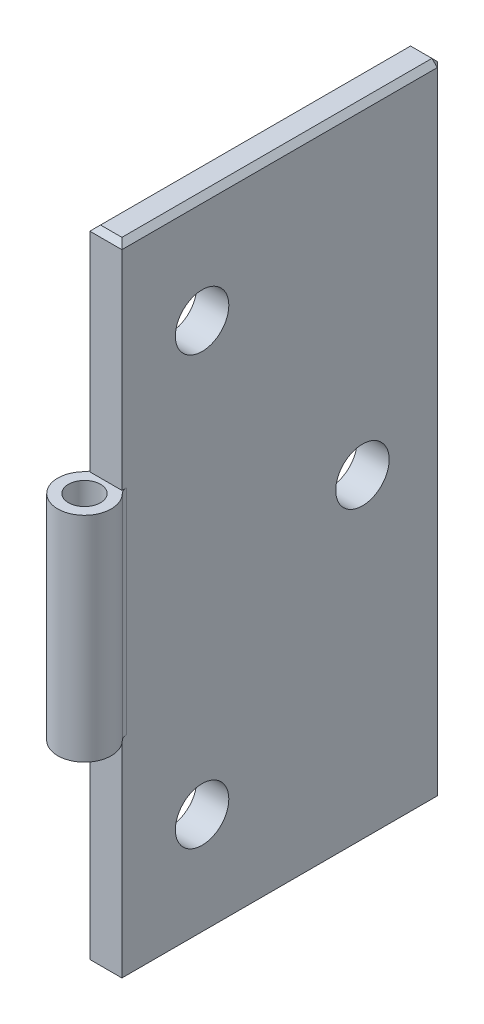
ISO-10303-21;
HEADER;
FILE_DESCRIPTION(('STEP AP214'),'2;1');
FILE_NAME('part.step','',(''),(''),'','','');
FILE_SCHEMA(('AUTOMOTIVE_DESIGN { 1 0 10303 214 1 1 1 1 }'));
ENDSEC;
DATA;
#1=APPLICATION_CONTEXT('core data for automotive mechanical design processes');
#2=APPLICATION_PROTOCOL_DEFINITION('international standard','automotive_design',2000,#1);
#3=PRODUCT_CONTEXT('',#1,'mechanical');
#4=PRODUCT('Part','Part','',(#3));
#5=PRODUCT_RELATED_PRODUCT_CATEGORY('part','',(#4));
#6=PRODUCT_DEFINITION_FORMATION('','',#4);
#7=PRODUCT_DEFINITION_CONTEXT('part definition',#1,'design');
#8=PRODUCT_DEFINITION('design','',#6,#7);
#9=PRODUCT_DEFINITION_SHAPE('','',#8);
#10=(LENGTH_UNIT() NAMED_UNIT(*) SI_UNIT(.MILLI.,.METRE.));
#11=(NAMED_UNIT(*) PLANE_ANGLE_UNIT() SI_UNIT($,.RADIAN.));
#12=(NAMED_UNIT(*) SI_UNIT($,.STERADIAN.) SOLID_ANGLE_UNIT());
#13=UNCERTAINTY_MEASURE_WITH_UNIT(LENGTH_MEASURE(1.E-05),#10,'distance_accuracy_value','');
#14=(GEOMETRIC_REPRESENTATION_CONTEXT(3) GLOBAL_UNCERTAINTY_ASSIGNED_CONTEXT((#13)) GLOBAL_UNIT_ASSIGNED_CONTEXT((#10,
#11,#12)) REPRESENTATION_CONTEXT('',''));
#15=CARTESIAN_POINT('',(0.,0.,0.));
#16=DIRECTION('',(0.,0.,1.));
#17=DIRECTION('',(1.,0.,0.));
#18=AXIS2_PLACEMENT_3D('',#15,#16,#17);
#19=CARTESIAN_POINT('',(1.5,-30.,15.));
#20=DIRECTION('',(0.,0.,-1.));
#21=DIRECTION('',(-1.,0.,0.));
#22=AXIS2_PLACEMENT_3D('',#19,#20,#21);
#23=PLANE('',#22);
#24=DIRECTION('',(0.,-1.,0.));
#25=VECTOR('',#24,1.);
#26=CARTESIAN_POINT('',(-1.5,-30.,15.));
#27=LINE('',#26,#25);
#28=CARTESIAN_POINT('',(-1.5,-10.,15.));
#29=VERTEX_POINT('',#28);
#30=CARTESIAN_POINT('',(-1.5,-29.5,15.));
#31=VERTEX_POINT('',#30);
#32=EDGE_CURVE('E181',#29,#31,#27,.T.);
#33=ORIENTED_EDGE('',*,*,#32,.T.);
#34=DIRECTION('',(1.,0.,0.));
#35=VECTOR('',#34,1.);
#36=CARTESIAN_POINT('',(1.5,-29.5,15.));
#37=LINE('',#36,#35);
#38=CARTESIAN_POINT('',(1.5,-29.5,15.));
#39=VERTEX_POINT('',#38);
#40=EDGE_CURVE('E177',#31,#39,#37,.T.);
#41=ORIENTED_EDGE('',*,*,#40,.T.);
#42=DIRECTION('',(0.,-1.,0.));
#43=VECTOR('',#42,1.);
#44=CARTESIAN_POINT('',(1.5,-30.,15.));
#45=LINE('',#44,#43);
#46=CARTESIAN_POINT('',(1.5,-10.,15.));
#47=VERTEX_POINT('',#46);
#48=EDGE_CURVE('E155',#47,#39,#45,.T.);
#49=ORIENTED_EDGE('',*,*,#48,.F.);
#50=DIRECTION('',(-1.,0.,0.));
#51=VECTOR('',#50,1.);
#52=CARTESIAN_POINT('',(-1.5,-10.,15.));
#53=LINE('',#52,#51);
#54=EDGE_CURVE('E164',#47,#29,#53,.T.);
#55=ORIENTED_EDGE('',*,*,#54,.T.);
#56=EDGE_LOOP('',(#33,#41,#49,#55));
#57=FACE_BOUND('',#56,.T.);
#58=ADVANCED_FACE('F36',(#57),#23,.F.);
#59=CARTESIAN_POINT('',(1.5,0.,0.));
#60=DIRECTION('',(1.,0.,0.));
#61=DIRECTION('',(0.,0.,-1.));
#62=AXIS2_PLACEMENT_3D('',#59,#60,#61);
#63=PLANE('',#62);
#64=CARTESIAN_POINT('',(1.5,0.,-7.5));
#65=DIRECTION('',(1.,0.,0.));
#66=DIRECTION('',(0.,0.,-1.));
#67=AXIS2_PLACEMENT_3D('',#64,#65,#66);
#68=CIRCLE('',#67,2.5);
#69=CARTESIAN_POINT('',(1.5,0.,-10.));
#70=VERTEX_POINT('',#69);
#71=EDGE_CURVE('E314',#70,#70,#68,.T.);
#72=ORIENTED_EDGE('',*,*,#71,.F.);
#73=EDGE_LOOP('',(#72));
#74=FACE_BOUND('',#73,.T.);
#75=ORIENTED_EDGE('',*,*,#48,.T.);
#76=DIRECTION('',(0.,0.,-1.));
#77=VECTOR('',#76,1.);
#78=CARTESIAN_POINT('',(1.5,-29.5,-15.));
#79=LINE('',#78,#77);
#80=CARTESIAN_POINT('',(1.5,-29.5,-14.5));
#81=VERTEX_POINT('',#80);
#82=EDGE_CURVE('E223',#39,#81,#79,.T.);
#83=ORIENTED_EDGE('',*,*,#82,.T.);
#84=DIRECTION('',(0.,1.,0.));
#85=VECTOR('',#84,1.);
#86=CARTESIAN_POINT('',(1.5,30.,-14.5));
#87=LINE('',#86,#85);
#88=CARTESIAN_POINT('',(1.5,29.5,-14.5));
#89=VERTEX_POINT('',#88);
#90=EDGE_CURVE('E221',#81,#89,#87,.T.);
#91=ORIENTED_EDGE('',*,*,#90,.T.);
#92=DIRECTION('',(0.,0.,1.));
#93=VECTOR('',#92,1.);
#94=CARTESIAN_POINT('',(1.5,29.5,15.));
#95=LINE('',#94,#93);
#96=CARTESIAN_POINT('',(1.5,29.5,15.));
#97=VERTEX_POINT('',#96);
#98=EDGE_CURVE('E219',#89,#97,#95,.T.);
#99=ORIENTED_EDGE('',*,*,#98,.T.);
#100=CARTESIAN_POINT('',(1.5,9.99999999999999,15.));
#101=VERTEX_POINT('',#100);
#102=EDGE_CURVE('E178',#97,#101,#45,.T.);
#103=ORIENTED_EDGE('',*,*,#102,.T.);
#104=DIRECTION('',(0.,0.,-1.));
#105=VECTOR('',#104,1.);
#106=CARTESIAN_POINT('',(1.5,9.99999999999999,17.));
#107=LINE('',#106,#105);
#108=CARTESIAN_POINT('',(1.5,9.99999999999999,14.5505102572168));
#109=VERTEX_POINT('',#108);
#110=EDGE_CURVE('E199',#101,#109,#107,.T.);
#111=ORIENTED_EDGE('',*,*,#110,.T.);
#112=DIRECTION('',(0.,-1.,0.));
#113=VECTOR('',#112,1.);
#114=CARTESIAN_POINT('',(1.5,-10.,14.5505102572168));
#115=LINE('',#114,#113);
#116=CARTESIAN_POINT('',(1.5,-10.,14.5505102572168));
#117=VERTEX_POINT('',#116);
#118=EDGE_CURVE('E158',#109,#117,#115,.T.);
#119=ORIENTED_EDGE('',*,*,#118,.T.);
#120=DIRECTION('',(0.,0.,1.));
#121=VECTOR('',#120,1.);
#122=CARTESIAN_POINT('',(1.5,-10.,0.));
#123=LINE('',#122,#121);
#124=EDGE_CURVE('E150',#117,#47,#123,.T.);
#125=ORIENTED_EDGE('',*,*,#124,.T.);
#126=EDGE_LOOP('',(#75,#83,#91,#99,#103,#111,#119,#125));
#127=FACE_BOUND('',#126,.T.);
#128=CARTESIAN_POINT('',(1.5,20.,7.5));
#129=DIRECTION('',(1.,0.,0.));
#130=DIRECTION('',(0.,0.,-1.));
#131=AXIS2_PLACEMENT_3D('',#128,#129,#130);
#132=CIRCLE('',#131,2.5);
#133=CARTESIAN_POINT('',(1.5,20.,5.));
#134=VERTEX_POINT('',#133);
#135=EDGE_CURVE('E318',#134,#134,#132,.T.);
#136=ORIENTED_EDGE('',*,*,#135,.F.);
#137=EDGE_LOOP('',(#136));
#138=FACE_BOUND('',#137,.T.);
#139=CARTESIAN_POINT('',(1.5,-20.,7.5));
#140=DIRECTION('',(1.,0.,0.));
#141=DIRECTION('',(0.,0.,-1.));
#142=AXIS2_PLACEMENT_3D('',#139,#140,#141);
#143=CIRCLE('',#142,2.5);
#144=CARTESIAN_POINT('',(1.5,-20.,5.));
#145=VERTEX_POINT('',#144);
#146=EDGE_CURVE('E308',#145,#145,#143,.T.);
#147=ORIENTED_EDGE('',*,*,#146,.F.);
#148=EDGE_LOOP('',(#147));
#149=FACE_BOUND('',#148,.T.);
#150=ADVANCED_FACE('F152',(#74,#127,#138,#149),#63,.T.);
#151=CARTESIAN_POINT('',(-1.5,0.,0.));
#152=DIRECTION('',(1.,0.,0.));
#153=DIRECTION('',(0.,0.,-1.));
#154=AXIS2_PLACEMENT_3D('',#151,#152,#153);
#155=PLANE('',#154);
#156=DIRECTION('',(0.,-1.,0.));
#157=VECTOR('',#156,1.);
#158=CARTESIAN_POINT('',(-1.5,0.,-14.5));
#159=LINE('',#158,#157);
#160=CARTESIAN_POINT('',(-1.5,29.5,-14.5));
#161=VERTEX_POINT('',#160);
#162=CARTESIAN_POINT('',(-1.5,-29.5,-14.5));
#163=VERTEX_POINT('',#162);
#164=EDGE_CURVE('E227',#161,#163,#159,.T.);
#165=ORIENTED_EDGE('',*,*,#164,.T.);
#166=DIRECTION('',(0.,0.,1.));
#167=VECTOR('',#166,1.);
#168=CARTESIAN_POINT('',(-1.5,-29.5,0.));
#169=LINE('',#168,#167);
#170=EDGE_CURVE('E229',#163,#31,#169,.T.);
#171=ORIENTED_EDGE('',*,*,#170,.T.);
#172=ORIENTED_EDGE('',*,*,#32,.F.);
#173=DIRECTION('',(0.,0.,-1.));
#174=VECTOR('',#173,1.);
#175=CARTESIAN_POINT('',(-1.5,-10.,17.));
#176=LINE('',#175,#174);
#177=CARTESIAN_POINT('',(-1.5,-10.,14.5505102572168));
#178=VERTEX_POINT('',#177);
#179=EDGE_CURVE('E168',#29,#178,#176,.T.);
#180=ORIENTED_EDGE('',*,*,#179,.T.);
#181=DIRECTION('',(0.,1.,0.));
#182=VECTOR('',#181,1.);
#183=CARTESIAN_POINT('',(-1.5,0.,14.5505102572168));
#184=LINE('',#183,#182);
#185=CARTESIAN_POINT('',(-1.5,9.99999999999999,14.5505102572168));
#186=VERTEX_POINT('',#185);
#187=EDGE_CURVE('E188',#178,#186,#184,.T.);
#188=ORIENTED_EDGE('',*,*,#187,.T.);
#189=DIRECTION('',(0.,0.,1.));
#190=VECTOR('',#189,1.);
#191=CARTESIAN_POINT('',(-1.5,10.,0.));
#192=LINE('',#191,#190);
#193=CARTESIAN_POINT('',(-1.5,9.99999999999999,15.));
#194=VERTEX_POINT('',#193);
#195=EDGE_CURVE('E191',#186,#194,#192,.T.);
#196=ORIENTED_EDGE('',*,*,#195,.T.);
#197=CARTESIAN_POINT('',(-1.5,29.5,15.));
#198=VERTEX_POINT('',#197);
#199=EDGE_CURVE('E179',#198,#194,#27,.T.);
#200=ORIENTED_EDGE('',*,*,#199,.F.);
#201=DIRECTION('',(0.,0.,-1.));
#202=VECTOR('',#201,1.);
#203=CARTESIAN_POINT('',(-1.5,29.5,0.));
#204=LINE('',#203,#202);
#205=EDGE_CURVE('E225',#198,#161,#204,.T.);
#206=ORIENTED_EDGE('',*,*,#205,.T.);
#207=EDGE_LOOP('',(#165,#171,#172,#180,#188,#196,#200,#206));
#208=FACE_BOUND('',#207,.T.);
#209=CARTESIAN_POINT('',(-1.5,20.,7.5));
#210=DIRECTION('',(1.,0.,0.));
#211=DIRECTION('',(0.,0.,-1.));
#212=AXIS2_PLACEMENT_3D('',#209,#210,#211);
#213=CIRCLE('',#212,2.5);
#214=CARTESIAN_POINT('',(-1.5,20.,5.));
#215=VERTEX_POINT('',#214);
#216=EDGE_CURVE('E184',#215,#215,#213,.T.);
#217=ORIENTED_EDGE('',*,*,#216,.T.);
#218=EDGE_LOOP('',(#217));
#219=FACE_BOUND('',#218,.T.);
#220=CARTESIAN_POINT('',(-1.5,0.,-7.5));
#221=DIRECTION('',(1.,0.,0.));
#222=DIRECTION('',(0.,0.,-1.));
#223=AXIS2_PLACEMENT_3D('',#220,#221,#222);
#224=CIRCLE('',#223,2.5);
#225=CARTESIAN_POINT('',(-1.5,0.,-10.));
#226=VERTEX_POINT('',#225);
#227=EDGE_CURVE('E311',#226,#226,#224,.T.);
#228=ORIENTED_EDGE('',*,*,#227,.T.);
#229=EDGE_LOOP('',(#228));
#230=FACE_BOUND('',#229,.T.);
#231=CARTESIAN_POINT('',(-1.5,-20.,7.5));
#232=DIRECTION('',(1.,0.,0.));
#233=DIRECTION('',(0.,0.,-1.));
#234=AXIS2_PLACEMENT_3D('',#231,#232,#233);
#235=CIRCLE('',#234,2.5);
#236=CARTESIAN_POINT('',(-1.5,-20.,5.));
#237=VERTEX_POINT('',#236);
#238=EDGE_CURVE('E172',#237,#237,#235,.T.);
#239=ORIENTED_EDGE('',*,*,#238,.T.);
#240=EDGE_LOOP('',(#239));
#241=FACE_BOUND('',#240,.T.);
#242=ADVANCED_FACE('F325',(#208,#219,#230,#241),#155,.F.);
#243=ORIENTED_EDGE('',*,*,#102,.F.);
#244=DIRECTION('',(-1.,0.,0.));
#245=VECTOR('',#244,1.);
#246=CARTESIAN_POINT('',(1.5,29.5,15.));
#247=LINE('',#246,#245);
#248=EDGE_CURVE('E11',#97,#198,#247,.T.);
#249=ORIENTED_EDGE('',*,*,#248,.T.);
#250=ORIENTED_EDGE('',*,*,#199,.T.);
#251=DIRECTION('',(-1.,0.,0.));
#252=VECTOR('',#251,1.);
#253=CARTESIAN_POINT('',(-1.5,9.99999999999999,15.));
#254=LINE('',#253,#252);
#255=EDGE_CURVE('E302',#101,#194,#254,.T.);
#256=ORIENTED_EDGE('',*,*,#255,.F.);
#257=EDGE_LOOP('',(#243,#249,#250,#256));
#258=FACE_BOUND('',#257,.T.);
#259=ADVANCED_FACE('F345',(#258),#23,.F.);
#260=CARTESIAN_POINT('',(1.5,-30.,-15.));
#261=DIRECTION('',(0.,1.,0.));
#262=DIRECTION('',(0.,0.,1.));
#263=AXIS2_PLACEMENT_3D('',#260,#261,#262);
#264=PLANE('',#263);
#265=DIRECTION('',(0.,0.,1.));
#266=VECTOR('',#265,1.);
#267=CARTESIAN_POINT('',(0.999999999999993,-30.,15.));
#268=LINE('',#267,#266);
#269=CARTESIAN_POINT('',(0.999999999999993,-30.,-14.5));
#270=VERTEX_POINT('',#269);
#271=CARTESIAN_POINT('',(0.999999999999993,-30.,14.5));
#272=VERTEX_POINT('',#271);
#273=EDGE_CURVE('E213',#270,#272,#268,.T.);
#274=ORIENTED_EDGE('',*,*,#273,.T.);
#275=DIRECTION('',(-1.,0.,0.));
#276=VECTOR('',#275,1.);
#277=CARTESIAN_POINT('',(1.5,-30.,14.5));
#278=LINE('',#277,#276);
#279=CARTESIAN_POINT('',(-0.999999999999993,-30.,14.5));
#280=VERTEX_POINT('',#279);
#281=EDGE_CURVE('E215',#272,#280,#278,.T.);
#282=ORIENTED_EDGE('',*,*,#281,.T.);
#283=DIRECTION('',(0.,0.,-1.));
#284=VECTOR('',#283,1.);
#285=CARTESIAN_POINT('',(-0.999999999999993,-30.,-15.));
#286=LINE('',#285,#284);
#287=CARTESIAN_POINT('',(-0.999999999999993,-30.,-14.5));
#288=VERTEX_POINT('',#287);
#289=EDGE_CURVE('E211',#280,#288,#286,.T.);
#290=ORIENTED_EDGE('',*,*,#289,.T.);
#291=DIRECTION('',(1.,0.,0.));
#292=VECTOR('',#291,1.);
#293=CARTESIAN_POINT('',(1.5,-30.,-14.5));
#294=LINE('',#293,#292);
#295=EDGE_CURVE('E209',#288,#270,#294,.T.);
#296=ORIENTED_EDGE('',*,*,#295,.T.);
#297=EDGE_LOOP('',(#274,#282,#290,#296));
#298=FACE_BOUND('',#297,.T.);
#299=ADVANCED_FACE('F353',(#298),#264,.F.);
#300=CARTESIAN_POINT('',(1.5,-30.,-15.));
#301=DIRECTION('',(0.,0.,1.));
#302=DIRECTION('',(1.,0.,0.));
#303=AXIS2_PLACEMENT_3D('',#300,#301,#302);
#304=PLANE('',#303);
#305=DIRECTION('',(0.,-1.,0.));
#306=VECTOR('',#305,1.);
#307=CARTESIAN_POINT('',(0.999999999999993,-30.,-15.));
#308=LINE('',#307,#306);
#309=CARTESIAN_POINT('',(0.999999999999993,29.5,-15.));
#310=VERTEX_POINT('',#309);
#311=CARTESIAN_POINT('',(0.999999999999993,-29.5,-15.));
#312=VERTEX_POINT('',#311);
#313=EDGE_CURVE('E235',#310,#312,#308,.T.);
#314=ORIENTED_EDGE('',*,*,#313,.T.);
#315=DIRECTION('',(-1.,0.,0.));
#316=VECTOR('',#315,1.);
#317=CARTESIAN_POINT('',(1.5,-29.5,-15.));
#318=LINE('',#317,#316);
#319=CARTESIAN_POINT('',(-0.999999999999993,-29.5,-15.));
#320=VERTEX_POINT('',#319);
#321=EDGE_CURVE('E237',#312,#320,#318,.T.);
#322=ORIENTED_EDGE('',*,*,#321,.T.);
#323=DIRECTION('',(0.,1.,0.));
#324=VECTOR('',#323,1.);
#325=CARTESIAN_POINT('',(-0.999999999999993,-30.,-15.));
#326=LINE('',#325,#324);
#327=CARTESIAN_POINT('',(-0.999999999999993,29.5,-15.));
#328=VERTEX_POINT('',#327);
#329=EDGE_CURVE('E233',#320,#328,#326,.T.);
#330=ORIENTED_EDGE('',*,*,#329,.T.);
#331=DIRECTION('',(1.,0.,0.));
#332=VECTOR('',#331,1.);
#333=CARTESIAN_POINT('',(1.5,29.5,-15.));
#334=LINE('',#333,#332);
#335=EDGE_CURVE('E231',#328,#310,#334,.T.);
#336=ORIENTED_EDGE('',*,*,#335,.T.);
#337=EDGE_LOOP('',(#314,#322,#330,#336));
#338=FACE_BOUND('',#337,.T.);
#339=ADVANCED_FACE('F340',(#338),#304,.F.);
#340=CARTESIAN_POINT('',(1.5,30.,-15.));
#341=DIRECTION('',(0.,-1.,0.));
#342=DIRECTION('',(0.,0.,-1.));
#343=AXIS2_PLACEMENT_3D('',#340,#341,#342);
#344=PLANE('',#343);
#345=DIRECTION('',(0.,0.,-1.));
#346=VECTOR('',#345,1.);
#347=CARTESIAN_POINT('',(0.999999999999993,30.,-15.));
#348=LINE('',#347,#346);
#349=CARTESIAN_POINT('',(0.999999999999993,30.,14.5));
#350=VERTEX_POINT('',#349);
#351=CARTESIAN_POINT('',(0.999999999999993,30.,-14.5));
#352=VERTEX_POINT('',#351);
#353=EDGE_CURVE('E53',#350,#352,#348,.T.);
#354=ORIENTED_EDGE('',*,*,#353,.T.);
#355=DIRECTION('',(-1.,0.,0.));
#356=VECTOR('',#355,1.);
#357=CARTESIAN_POINT('',(1.5,30.,-14.5));
#358=LINE('',#357,#356);
#359=CARTESIAN_POINT('',(-0.999999999999993,30.,-14.5));
#360=VERTEX_POINT('',#359);
#361=EDGE_CURVE('E45',#352,#360,#358,.T.);
#362=ORIENTED_EDGE('',*,*,#361,.T.);
#363=DIRECTION('',(0.,0.,1.));
#364=VECTOR('',#363,1.);
#365=CARTESIAN_POINT('',(-0.999999999999993,30.,-15.));
#366=LINE('',#365,#364);
#367=CARTESIAN_POINT('',(-0.999999999999993,30.,14.5));
#368=VERTEX_POINT('',#367);
#369=EDGE_CURVE('E240',#360,#368,#366,.T.);
#370=ORIENTED_EDGE('',*,*,#369,.T.);
#371=DIRECTION('',(1.,0.,0.));
#372=VECTOR('',#371,1.);
#373=CARTESIAN_POINT('',(1.5,30.,14.5));
#374=LINE('',#373,#372);
#375=EDGE_CURVE('E58',#368,#350,#374,.T.);
#376=ORIENTED_EDGE('',*,*,#375,.T.);
#377=EDGE_LOOP('',(#354,#362,#370,#376));
#378=FACE_BOUND('',#377,.T.);
#379=ADVANCED_FACE('F331',(#378),#344,.F.);
#380=CARTESIAN_POINT('',(1.5,20.,7.5));
#381=DIRECTION('',(-1.,0.,0.));
#382=DIRECTION('',(0.,0.,1.));
#383=AXIS2_PLACEMENT_3D('',#380,#381,#382);
#384=CYLINDRICAL_SURFACE('',#383,2.5);
#385=ORIENTED_EDGE('',*,*,#135,.T.);
#386=EDGE_LOOP('',(#385));
#387=FACE_BOUND('',#386,.T.);
#388=ORIENTED_EDGE('',*,*,#216,.F.);
#389=EDGE_LOOP('',(#388));
#390=FACE_BOUND('',#389,.T.);
#391=ADVANCED_FACE('F328',(#387,#390),#384,.F.);
#392=CARTESIAN_POINT('',(1.5,0.,-7.5));
#393=DIRECTION('',(-1.,0.,0.));
#394=DIRECTION('',(0.,0.,1.));
#395=AXIS2_PLACEMENT_3D('',#392,#393,#394);
#396=CYLINDRICAL_SURFACE('',#395,2.5);
#397=ORIENTED_EDGE('',*,*,#71,.T.);
#398=EDGE_LOOP('',(#397));
#399=FACE_BOUND('',#398,.T.);
#400=ORIENTED_EDGE('',*,*,#227,.F.);
#401=EDGE_LOOP('',(#400));
#402=FACE_BOUND('',#401,.T.);
#403=ADVANCED_FACE('F330',(#399,#402),#396,.F.);
#404=CARTESIAN_POINT('',(1.5,-20.,7.5));
#405=DIRECTION('',(-1.,0.,0.));
#406=DIRECTION('',(0.,0.,1.));
#407=AXIS2_PLACEMENT_3D('',#404,#405,#406);
#408=CYLINDRICAL_SURFACE('',#407,2.5);
#409=ORIENTED_EDGE('',*,*,#146,.T.);
#410=EDGE_LOOP('',(#409));
#411=FACE_BOUND('',#410,.T.);
#412=ORIENTED_EDGE('',*,*,#238,.F.);
#413=EDGE_LOOP('',(#412));
#414=FACE_BOUND('',#413,.T.);
#415=ADVANCED_FACE('F337',(#411,#414),#408,.F.);
#416=CARTESIAN_POINT('',(0.,-10.,17.));
#417=DIRECTION('',(0.,1.,0.));
#418=DIRECTION('',(0.,0.,1.));
#419=AXIS2_PLACEMENT_3D('',#416,#417,#418);
#420=CYLINDRICAL_SURFACE('',#419,2.5);
#421=CARTESIAN_POINT('',(0.,9.99999999999999,17.));
#422=DIRECTION('',(0.,1.,0.));
#423=DIRECTION('',(0.,0.,1.));
#424=AXIS2_PLACEMENT_3D('',#421,#422,#423);
#425=CIRCLE('',#424,2.5);
#426=CARTESIAN_POINT('',(-1.78571428571429,9.99999999999999,15.2503644694406));
#427=VERTEX_POINT('',#426);
#428=CARTESIAN_POINT('',(1.78571428571429,9.99999999999999,15.2503644694406));
#429=VERTEX_POINT('',#428);
#430=EDGE_CURVE('E298',#427,#429,#425,.T.);
#431=ORIENTED_EDGE('',*,*,#430,.F.);
#432=DIRECTION('',(0.,1.,0.));
#433=VECTOR('',#432,1.);
#434=CARTESIAN_POINT('',(-1.78571428571429,-10.,15.2503644694406));
#435=LINE('',#434,#433);
#436=CARTESIAN_POINT('',(-1.78571428571429,-10.,15.2503644694406));
#437=VERTEX_POINT('',#436);
#438=EDGE_CURVE('E161',#427,#437,#435,.F.);
#439=ORIENTED_EDGE('',*,*,#438,.T.);
#440=CARTESIAN_POINT('',(0.,-10.,17.));
#441=DIRECTION('',(0.,1.,0.));
#442=DIRECTION('',(0.,0.,1.));
#443=AXIS2_PLACEMENT_3D('',#440,#441,#442);
#444=CIRCLE('',#443,2.5);
#445=CARTESIAN_POINT('',(1.78571428571429,-10.,15.2503644694406));
#446=VERTEX_POINT('',#445);
#447=EDGE_CURVE('E173',#437,#446,#444,.T.);
#448=ORIENTED_EDGE('',*,*,#447,.T.);
#449=DIRECTION('',(0.,1.,0.));
#450=VECTOR('',#449,1.);
#451=CARTESIAN_POINT('',(1.78571428571429,-10.,15.2503644694406));
#452=LINE('',#451,#450);
#453=EDGE_CURVE('E194',#446,#429,#452,.T.);
#454=ORIENTED_EDGE('',*,*,#453,.T.);
#455=EDGE_LOOP('',(#431,#439,#448,#454));
#456=FACE_BOUND('',#455,.T.);
#457=ADVANCED_FACE('F383',(#456),#420,.T.);
#458=CARTESIAN_POINT('',(0.,-10.,17.));
#459=DIRECTION('',(0.,1.,0.));
#460=DIRECTION('',(0.,0.,1.));
#461=AXIS2_PLACEMENT_3D('',#458,#459,#460);
#462=PLANE('',#461);
#463=CARTESIAN_POINT('',(0.,-10.,17.));
#464=DIRECTION('',(0.,1.,0.));
#465=DIRECTION('',(0.,0.,1.));
#466=AXIS2_PLACEMENT_3D('',#463,#464,#465);
#467=CIRCLE('',#466,1.5);
#468=CARTESIAN_POINT('',(0.,-10.,18.5));
#469=VERTEX_POINT('',#468);
#470=EDGE_CURVE('E293',#469,#469,#467,.T.);
#471=ORIENTED_EDGE('',*,*,#470,.T.);
#472=EDGE_LOOP('',(#471));
#473=FACE_BOUND('',#472,.T.);
#474=ORIENTED_EDGE('',*,*,#447,.F.);
#475=CARTESIAN_POINT('',(-2.5,-10.,14.5505102572168));
#476=DIRECTION('',(0.,1.,0.));
#477=DIRECTION('',(0.,0.,1.));
#478=AXIS2_PLACEMENT_3D('',#475,#476,#477);
#479=CIRCLE('',#478,1.);
#480=EDGE_CURVE('E203',#437,#178,#479,.T.);
#481=ORIENTED_EDGE('',*,*,#480,.T.);
#482=ORIENTED_EDGE('',*,*,#179,.F.);
#483=ORIENTED_EDGE('',*,*,#54,.F.);
#484=ORIENTED_EDGE('',*,*,#124,.F.);
#485=CARTESIAN_POINT('',(2.5,-10.,14.5505102572168));
#486=DIRECTION('',(0.,1.,0.));
#487=DIRECTION('',(0.,0.,1.));
#488=AXIS2_PLACEMENT_3D('',#485,#486,#487);
#489=CIRCLE('',#488,1.);
#490=EDGE_CURVE('E207',#117,#446,#489,.T.);
#491=ORIENTED_EDGE('',*,*,#490,.T.);
#492=EDGE_LOOP('',(#474,#481,#482,#483,#484,#491));
#493=FACE_BOUND('',#492,.T.);
#494=ADVANCED_FACE('F166',(#473,#493),#462,.F.);
#495=CARTESIAN_POINT('',(0.,9.99999999999999,17.));
#496=DIRECTION('',(0.,1.,0.));
#497=DIRECTION('',(0.,0.,1.));
#498=AXIS2_PLACEMENT_3D('',#495,#496,#497);
#499=PLANE('',#498);
#500=CARTESIAN_POINT('',(0.,9.99999999999999,17.));
#501=DIRECTION('',(0.,1.,0.));
#502=DIRECTION('',(0.,0.,1.));
#503=AXIS2_PLACEMENT_3D('',#500,#501,#502);
#504=CIRCLE('',#503,1.5);
#505=CARTESIAN_POINT('',(0.,9.99999999999999,18.5));
#506=VERTEX_POINT('',#505);
#507=EDGE_CURVE('E289',#506,#506,#504,.T.);
#508=ORIENTED_EDGE('',*,*,#507,.F.);
#509=EDGE_LOOP('',(#508));
#510=FACE_BOUND('',#509,.T.);
#511=ORIENTED_EDGE('',*,*,#255,.T.);
#512=ORIENTED_EDGE('',*,*,#195,.F.);
#513=CARTESIAN_POINT('',(-2.5,9.99999999999999,14.5505102572168));
#514=DIRECTION('',(0.,1.,0.));
#515=DIRECTION('',(0.,0.,1.));
#516=AXIS2_PLACEMENT_3D('',#513,#514,#515);
#517=CIRCLE('',#516,1.);
#518=EDGE_CURVE('E201',#186,#427,#517,.F.);
#519=ORIENTED_EDGE('',*,*,#518,.T.);
#520=ORIENTED_EDGE('',*,*,#430,.T.);
#521=CARTESIAN_POINT('',(2.5,9.99999999999999,14.5505102572168));
#522=DIRECTION('',(0.,1.,0.));
#523=DIRECTION('',(0.,0.,1.));
#524=AXIS2_PLACEMENT_3D('',#521,#522,#523);
#525=CIRCLE('',#524,1.);
#526=EDGE_CURVE('E205',#429,#109,#525,.F.);
#527=ORIENTED_EDGE('',*,*,#526,.T.);
#528=ORIENTED_EDGE('',*,*,#110,.F.);
#529=EDGE_LOOP('',(#511,#512,#519,#520,#527,#528));
#530=FACE_BOUND('',#529,.T.);
#531=ADVANCED_FACE('F376',(#510,#530),#499,.T.);
#532=CARTESIAN_POINT('',(0.,-10.,17.));
#533=DIRECTION('',(0.,1.,0.));
#534=DIRECTION('',(0.,0.,1.));
#535=AXIS2_PLACEMENT_3D('',#532,#533,#534);
#536=CYLINDRICAL_SURFACE('',#535,1.5);
#537=ORIENTED_EDGE('',*,*,#470,.F.);
#538=EDGE_LOOP('',(#537));
#539=FACE_BOUND('',#538,.T.);
#540=ORIENTED_EDGE('',*,*,#507,.T.);
#541=EDGE_LOOP('',(#540));
#542=FACE_BOUND('',#541,.T.);
#543=ADVANCED_FACE('F464',(#539,#542),#536,.F.);
#544=CARTESIAN_POINT('',(-2.5,-10.,14.5505102572168));
#545=DIRECTION('',(0.,1.,0.));
#546=DIRECTION('',(0.,0.,1.));
#547=AXIS2_PLACEMENT_3D('',#544,#545,#546);
#548=CYLINDRICAL_SURFACE('',#547,1.);
#549=ORIENTED_EDGE('',*,*,#480,.F.);
#550=ORIENTED_EDGE('',*,*,#438,.F.);
#551=ORIENTED_EDGE('',*,*,#518,.F.);
#552=ORIENTED_EDGE('',*,*,#187,.F.);
#553=EDGE_LOOP('',(#549,#550,#551,#552));
#554=FACE_BOUND('',#553,.T.);
#555=ADVANCED_FACE('F386',(#554),#548,.F.);
#556=CARTESIAN_POINT('',(2.5,-10.,14.5505102572168));
#557=DIRECTION('',(0.,1.,0.));
#558=DIRECTION('',(0.,0.,1.));
#559=AXIS2_PLACEMENT_3D('',#556,#557,#558);
#560=CYLINDRICAL_SURFACE('',#559,1.);
#561=ORIENTED_EDGE('',*,*,#490,.F.);
#562=ORIENTED_EDGE('',*,*,#118,.F.);
#563=ORIENTED_EDGE('',*,*,#526,.F.);
#564=ORIENTED_EDGE('',*,*,#453,.F.);
#565=EDGE_LOOP('',(#561,#562,#563,#564));
#566=FACE_BOUND('',#565,.T.);
#567=ADVANCED_FACE('F378',(#566),#560,.F.);
#568=CARTESIAN_POINT('',(1.5,29.5,15.));
#569=DIRECTION('',(0.,-0.70710678118655,-0.707106781186545));
#570=DIRECTION('',(-1.,0.,0.));
#571=AXIS2_PLACEMENT_3D('',#568,#569,#570);
#572=PLANE('',#571);
#573=DIRECTION('',(0.577350269189624,0.577350269189625,-0.577350269189629));
#574=VECTOR('',#573,1.);
#575=CARTESIAN_POINT('',(8.83333333333336,39.8333333333333,4.66666666666657));
#576=LINE('',#575,#574);
#577=EDGE_CURVE('E282',#198,#368,#576,.T.);
#578=ORIENTED_EDGE('',*,*,#577,.F.);
#579=ORIENTED_EDGE('',*,*,#248,.F.);
#580=DIRECTION('',(0.577350269189624,-0.577350269189625,0.577350269189629));
#581=VECTOR('',#580,1.);
#582=CARTESIAN_POINT('',(1.5,29.5,15.));
#583=LINE('',#582,#581);
#584=EDGE_CURVE('E40',#350,#97,#583,.T.);
#585=ORIENTED_EDGE('',*,*,#584,.F.);
#586=ORIENTED_EDGE('',*,*,#375,.F.);
#587=EDGE_LOOP('',(#578,#579,#585,#586));
#588=FACE_BOUND('',#587,.T.);
#589=ADVANCED_FACE('F38',(#588),#572,.F.);
#590=CARTESIAN_POINT('',(1.5,29.5,0.));
#591=DIRECTION('',(0.707106781186547,0.707106781186547,0.));
#592=DIRECTION('',(0.,0.,-1.));
#593=AXIS2_PLACEMENT_3D('',#590,#591,#592);
#594=PLANE('',#593);
#595=ORIENTED_EDGE('',*,*,#584,.T.);
#596=ORIENTED_EDGE('',*,*,#98,.F.);
#597=DIRECTION('',(0.707106781186547,-0.707106781186547,0.));
#598=VECTOR('',#597,1.);
#599=CARTESIAN_POINT('',(1.5,29.5,-14.5));
#600=LINE('',#599,#598);
#601=EDGE_CURVE('E280',#352,#89,#600,.T.);
#602=ORIENTED_EDGE('',*,*,#601,.F.);
#603=ORIENTED_EDGE('',*,*,#353,.F.);
#604=EDGE_LOOP('',(#595,#596,#602,#603));
#605=FACE_BOUND('',#604,.T.);
#606=ADVANCED_FACE('F426',(#605),#594,.T.);
#607=CARTESIAN_POINT('',(1.5,30.,-14.5));
#608=DIRECTION('',(0.,-0.707106781186547,0.707106781186547));
#609=DIRECTION('',(-1.,0.,0.));
#610=AXIS2_PLACEMENT_3D('',#607,#608,#609);
#611=PLANE('',#610);
#612=DIRECTION('',(0.,0.707106781186547,0.707106781186547));
#613=VECTOR('',#612,1.);
#614=CARTESIAN_POINT('',(-0.999999999999993,29.5,-15.));
#615=LINE('',#614,#613);
#616=EDGE_CURVE('E274',#360,#328,#615,.F.);
#617=ORIENTED_EDGE('',*,*,#616,.F.);
#618=ORIENTED_EDGE('',*,*,#361,.F.);
#619=DIRECTION('',(0.,-0.707106781186547,-0.707106781186547));
#620=VECTOR('',#619,1.);
#621=CARTESIAN_POINT('',(0.999999999999993,29.75,-14.75));
#622=LINE('',#621,#620);
#623=EDGE_CURVE('E277',#310,#352,#622,.F.);
#624=ORIENTED_EDGE('',*,*,#623,.F.);
#625=ORIENTED_EDGE('',*,*,#335,.F.);
#626=EDGE_LOOP('',(#617,#618,#624,#625));
#627=FACE_BOUND('',#626,.T.);
#628=ADVANCED_FACE('F422',(#627),#611,.F.);
#629=CARTESIAN_POINT('',(-0.999999999999993,30.,-15.));
#630=DIRECTION('',(0.707106781186547,-0.707106781186547,0.));
#631=DIRECTION('',(0.,0.,1.));
#632=AXIS2_PLACEMENT_3D('',#629,#630,#631);
#633=PLANE('',#632);
#634=ORIENTED_EDGE('',*,*,#577,.T.);
#635=ORIENTED_EDGE('',*,*,#369,.F.);
#636=DIRECTION('',(-0.707106781186547,-0.707106781186547,0.));
#637=VECTOR('',#636,1.);
#638=CARTESIAN_POINT('',(-1.25,29.75,-14.5));
#639=LINE('',#638,#637);
#640=EDGE_CURVE('E272',#161,#360,#639,.F.);
#641=ORIENTED_EDGE('',*,*,#640,.F.);
#642=ORIENTED_EDGE('',*,*,#205,.F.);
#643=EDGE_LOOP('',(#634,#635,#641,#642));
#644=FACE_BOUND('',#643,.T.);
#645=ADVANCED_FACE('F369',(#644),#633,.F.);
#646=CARTESIAN_POINT('',(1.5,29.5,-14.5));
#647=DIRECTION('',(0.577350269189626,0.577350269189626,-0.577350269189626));
#648=DIRECTION('',(-0.707106781186547,0.,-0.707106781186547));
#649=AXIS2_PLACEMENT_3D('',#646,#647,#648);
#650=PLANE('',#649);
#651=ORIENTED_EDGE('',*,*,#623,.T.);
#652=ORIENTED_EDGE('',*,*,#601,.T.);
#653=DIRECTION('',(-0.707106781186547,0.,-0.707106781186547));
#654=VECTOR('',#653,1.);
#655=CARTESIAN_POINT('',(1.5,29.5,-14.5));
#656=LINE('',#655,#654);
#657=EDGE_CURVE('E269',#310,#89,#656,.F.);
#658=ORIENTED_EDGE('',*,*,#657,.F.);
#659=EDGE_LOOP('',(#651,#652,#658));
#660=FACE_BOUND('',#659,.T.);
#661=ADVANCED_FACE('F425',(#660),#650,.T.);
#662=CARTESIAN_POINT('',(-0.999999999999993,29.5,-15.));
#663=DIRECTION('',(-0.577350269189626,0.577350269189626,-0.577350269189626));
#664=DIRECTION('',(-0.707106781186547,0.,0.707106781186547));
#665=AXIS2_PLACEMENT_3D('',#662,#663,#664);
#666=PLANE('',#665);
#667=ORIENTED_EDGE('',*,*,#640,.T.);
#668=ORIENTED_EDGE('',*,*,#616,.T.);
#669=DIRECTION('',(0.707106781186547,0.,-0.707106781186547));
#670=VECTOR('',#669,1.);
#671=CARTESIAN_POINT('',(-0.999999999999993,29.5,-15.));
#672=LINE('',#671,#670);
#673=EDGE_CURVE('E266',#161,#328,#672,.T.);
#674=ORIENTED_EDGE('',*,*,#673,.F.);
#675=EDGE_LOOP('',(#667,#668,#674));
#676=FACE_BOUND('',#675,.T.);
#677=ADVANCED_FACE('F438',(#676),#666,.T.);
#678=CARTESIAN_POINT('',(1.5,0.,-14.5));
#679=DIRECTION('',(0.707106781186547,0.,-0.707106781186547));
#680=DIRECTION('',(0.,-1.,0.));
#681=AXIS2_PLACEMENT_3D('',#678,#679,#680);
#682=PLANE('',#681);
#683=ORIENTED_EDGE('',*,*,#657,.T.);
#684=ORIENTED_EDGE('',*,*,#90,.F.);
#685=DIRECTION('',(0.707106781186548,0.,0.707106781186548));
#686=VECTOR('',#685,1.);
#687=CARTESIAN_POINT('',(1.5,-29.5,-14.5));
#688=LINE('',#687,#686);
#689=EDGE_CURVE('E263',#312,#81,#688,.T.);
#690=ORIENTED_EDGE('',*,*,#689,.F.);
#691=ORIENTED_EDGE('',*,*,#313,.F.);
#692=EDGE_LOOP('',(#683,#684,#690,#691));
#693=FACE_BOUND('',#692,.T.);
#694=ADVANCED_FACE('F407',(#693),#682,.T.);
#695=CARTESIAN_POINT('',(1.5,-29.5,-15.));
#696=DIRECTION('',(0.,0.707106781186547,0.707106781186547));
#697=DIRECTION('',(-1.,0.,0.));
#698=AXIS2_PLACEMENT_3D('',#695,#696,#697);
#699=PLANE('',#698);
#700=DIRECTION('',(0.,0.707106781186547,-0.707106781186547));
#701=VECTOR('',#700,1.);
#702=CARTESIAN_POINT('',(-0.999999999999993,-30.,-14.5));
#703=LINE('',#702,#701);
#704=EDGE_CURVE('E257',#320,#288,#703,.F.);
#705=ORIENTED_EDGE('',*,*,#704,.F.);
#706=ORIENTED_EDGE('',*,*,#321,.F.);
#707=DIRECTION('',(0.,-0.707106781186548,0.707106781186548));
#708=VECTOR('',#707,1.);
#709=CARTESIAN_POINT('',(0.999999999999993,-29.75,-14.75));
#710=LINE('',#709,#708);
#711=EDGE_CURVE('E260',#270,#312,#710,.F.);
#712=ORIENTED_EDGE('',*,*,#711,.F.);
#713=ORIENTED_EDGE('',*,*,#295,.F.);
#714=EDGE_LOOP('',(#705,#706,#712,#713));
#715=FACE_BOUND('',#714,.T.);
#716=ADVANCED_FACE('F415',(#715),#699,.F.);
#717=CARTESIAN_POINT('',(-0.999999999999993,-30.,-15.));
#718=DIRECTION('',(0.707106781186547,0.,0.707106781186547));
#719=DIRECTION('',(0.,1.,0.));
#720=AXIS2_PLACEMENT_3D('',#717,#718,#719);
#721=PLANE('',#720);
#722=ORIENTED_EDGE('',*,*,#673,.T.);
#723=ORIENTED_EDGE('',*,*,#329,.F.);
#724=DIRECTION('',(-0.707106781186547,0.,0.707106781186547));
#725=VECTOR('',#724,1.);
#726=CARTESIAN_POINT('',(-1.25,-29.5,-14.75));
#727=LINE('',#726,#725);
#728=EDGE_CURVE('E255',#163,#320,#727,.F.);
#729=ORIENTED_EDGE('',*,*,#728,.F.);
#730=ORIENTED_EDGE('',*,*,#164,.F.);
#731=EDGE_LOOP('',(#722,#723,#729,#730));
#732=FACE_BOUND('',#731,.T.);
#733=ADVANCED_FACE('F446',(#732),#721,.F.);
#734=CARTESIAN_POINT('',(1.5,-29.5,-14.5));
#735=DIRECTION('',(0.577350269189623,-0.577350269189627,-0.577350269189627));
#736=DIRECTION('',(0.,0.707106781186547,-0.707106781186547));
#737=AXIS2_PLACEMENT_3D('',#734,#735,#736);
#738=PLANE('',#737);
#739=ORIENTED_EDGE('',*,*,#711,.T.);
#740=ORIENTED_EDGE('',*,*,#689,.T.);
#741=DIRECTION('',(-0.707106781186549,-0.707106781186546,0.));
#742=VECTOR('',#741,1.);
#743=CARTESIAN_POINT('',(1.5,-29.5,-14.5));
#744=LINE('',#743,#742);
#745=EDGE_CURVE('E252',#270,#81,#744,.F.);
#746=ORIENTED_EDGE('',*,*,#745,.F.);
#747=EDGE_LOOP('',(#739,#740,#746));
#748=FACE_BOUND('',#747,.T.);
#749=ADVANCED_FACE('F411',(#748),#738,.T.);
#750=CARTESIAN_POINT('',(-0.999999999999993,-30.,-14.5));
#751=DIRECTION('',(-0.577350269189626,-0.577350269189626,-0.577350269189626));
#752=DIRECTION('',(-0.707106781186547,0.,0.707106781186547));
#753=AXIS2_PLACEMENT_3D('',#750,#751,#752);
#754=PLANE('',#753);
#755=ORIENTED_EDGE('',*,*,#728,.T.);
#756=ORIENTED_EDGE('',*,*,#704,.T.);
#757=DIRECTION('',(0.707106781186549,-0.707106781186546,0.));
#758=VECTOR('',#757,1.);
#759=CARTESIAN_POINT('',(-0.999999999999993,-30.,-14.5));
#760=LINE('',#759,#758);
#761=EDGE_CURVE('E249',#163,#288,#760,.T.);
#762=ORIENTED_EDGE('',*,*,#761,.F.);
#763=EDGE_LOOP('',(#755,#756,#762));
#764=FACE_BOUND('',#763,.T.);
#765=ADVANCED_FACE('F452',(#764),#754,.T.);
#766=CARTESIAN_POINT('',(1.5,-29.5,0.));
#767=DIRECTION('',(0.707106781186546,-0.707106781186549,0.));
#768=DIRECTION('',(0.,0.,1.));
#769=AXIS2_PLACEMENT_3D('',#766,#767,#768);
#770=PLANE('',#769);
#771=ORIENTED_EDGE('',*,*,#745,.T.);
#772=ORIENTED_EDGE('',*,*,#82,.F.);
#773=DIRECTION('',(0.577350269189627,0.577350269189625,0.577350269189625));
#774=VECTOR('',#773,1.);
#775=CARTESIAN_POINT('',(-3.50000000000001,-34.5,10.));
#776=LINE('',#775,#774);
#777=EDGE_CURVE('E247',#272,#39,#776,.T.);
#778=ORIENTED_EDGE('',*,*,#777,.F.);
#779=ORIENTED_EDGE('',*,*,#273,.F.);
#780=EDGE_LOOP('',(#771,#772,#778,#779));
#781=FACE_BOUND('',#780,.T.);
#782=ADVANCED_FACE('F402',(#781),#770,.T.);
#783=CARTESIAN_POINT('',(-0.999999999999993,-30.,-15.));
#784=DIRECTION('',(0.707106781186546,0.707106781186549,0.));
#785=DIRECTION('',(0.,0.,-1.));
#786=AXIS2_PLACEMENT_3D('',#783,#784,#785);
#787=PLANE('',#786);
#788=ORIENTED_EDGE('',*,*,#761,.T.);
#789=ORIENTED_EDGE('',*,*,#289,.F.);
#790=DIRECTION('',(-0.577350269189627,0.577350269189625,0.577350269189625));
#791=VECTOR('',#790,1.);
#792=CARTESIAN_POINT('',(8.83333333333335,-39.8333333333333,4.66666666666669));
#793=LINE('',#792,#791);
#794=EDGE_CURVE('E245',#31,#280,#793,.F.);
#795=ORIENTED_EDGE('',*,*,#794,.F.);
#796=ORIENTED_EDGE('',*,*,#170,.F.);
#797=EDGE_LOOP('',(#788,#789,#795,#796));
#798=FACE_BOUND('',#797,.T.);
#799=ADVANCED_FACE('F396',(#798),#787,.F.);
#800=CARTESIAN_POINT('',(1.5,-30.,14.5));
#801=DIRECTION('',(0.,0.707106781186547,-0.707106781186547));
#802=DIRECTION('',(-1.,0.,0.));
#803=AXIS2_PLACEMENT_3D('',#800,#801,#802);
#804=PLANE('',#803);
#805=ORIENTED_EDGE('',*,*,#777,.T.);
#806=ORIENTED_EDGE('',*,*,#40,.F.);
#807=ORIENTED_EDGE('',*,*,#794,.T.);
#808=ORIENTED_EDGE('',*,*,#281,.F.);
#809=EDGE_LOOP('',(#805,#806,#807,#808));
#810=FACE_BOUND('',#809,.T.);
#811=ADVANCED_FACE('F390',(#810),#804,.F.);
#812=CLOSED_SHELL('',(#58,#150,#242,#259,#299,#339,#379,#391,#403,#415,#457,#494,#531,#543,#555,
#567,#589,#606,#628,#645,#661,#677,#694,#716,#733,#749,#765,#782,#799,#811));
#813=MANIFOLD_SOLID_BREP('B2',#812);
#814=ADVANCED_BREP_SHAPE_REPRESENTATION('',(#18,#813),#14);
#815=SHAPE_DEFINITION_REPRESENTATION(#9,#814);
ENDSEC;
END-ISO-10303-21;
